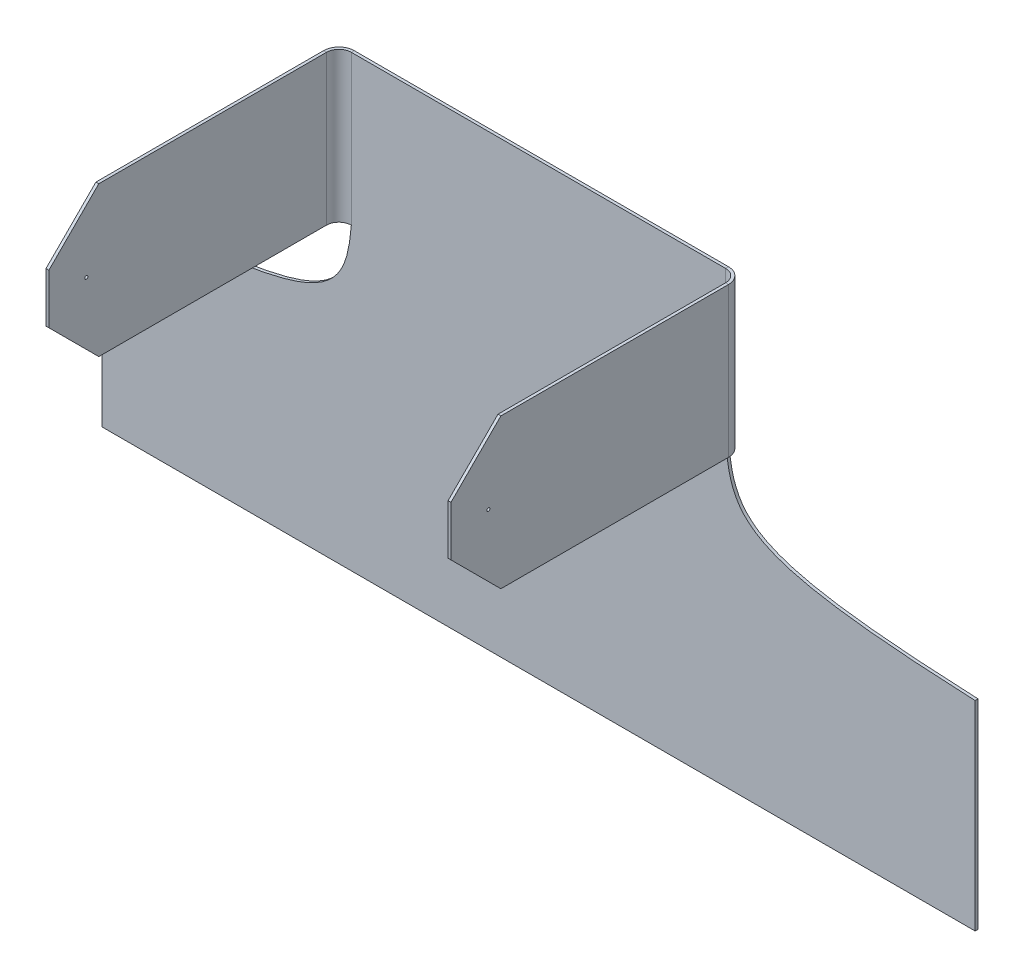
ISO-10303-21;
HEADER;
FILE_DESCRIPTION(('STEP AP214'),'2;1');
FILE_NAME('part.step','',(''),(''),'','','');
FILE_SCHEMA(('AUTOMOTIVE_DESIGN { 1 0 10303 214 1 1 1 1 }'));
ENDSEC;
DATA;
#1=APPLICATION_CONTEXT('core data for automotive mechanical design processes');
#2=APPLICATION_PROTOCOL_DEFINITION('international standard','automotive_design',2000,#1);
#3=PRODUCT_CONTEXT('',#1,'mechanical');
#4=PRODUCT('Part','Part','',(#3));
#5=PRODUCT_RELATED_PRODUCT_CATEGORY('part','',(#4));
#6=PRODUCT_DEFINITION_FORMATION('','',#4);
#7=PRODUCT_DEFINITION_CONTEXT('part definition',#1,'design');
#8=PRODUCT_DEFINITION('design','',#6,#7);
#9=PRODUCT_DEFINITION_SHAPE('','',#8);
#10=(LENGTH_UNIT() NAMED_UNIT(*) SI_UNIT(.MILLI.,.METRE.));
#11=(NAMED_UNIT(*) PLANE_ANGLE_UNIT() SI_UNIT($,.RADIAN.));
#12=(NAMED_UNIT(*) SI_UNIT($,.STERADIAN.) SOLID_ANGLE_UNIT());
#13=UNCERTAINTY_MEASURE_WITH_UNIT(LENGTH_MEASURE(1.E-05),#10,'distance_accuracy_value','');
#14=(GEOMETRIC_REPRESENTATION_CONTEXT(3) GLOBAL_UNCERTAINTY_ASSIGNED_CONTEXT((#13)) GLOBAL_UNIT_ASSIGNED_CONTEXT((#10,
#11,#12)) REPRESENTATION_CONTEXT('',''));
#15=CARTESIAN_POINT('',(0.,0.,0.));
#16=DIRECTION('',(0.,0.,1.));
#17=DIRECTION('',(1.,0.,0.));
#18=AXIS2_PLACEMENT_3D('',#15,#16,#17);
#19=CARTESIAN_POINT('',(13.8118325034129,38.0029528830563,0.));
#20=DIRECTION('',(0.,0.,-1.));
#21=DIRECTION('',(-1.,0.,0.));
#22=AXIS2_PLACEMENT_3D('',#19,#20,#21);
#23=PLANE('',#22);
#24=CARTESIAN_POINT('',(66.6047637195123,30.6321524390244,0.));
#25=CARTESIAN_POINT('',(8.97761047639618,33.1825692355034,0.));
#26=CARTESIAN_POINT('',(4.61743371969675,39.2705368266304,0.));
#27=CARTESIAN_POINT('',(3.10476371951222,56.0321524390244,0.));
#28=B_SPLINE_CURVE_WITH_KNOTS('',3,(#24,#25,#26,#27),.UNSPECIFIED.,.F.,.F.,(4,4),(0.,1.),.UNSPECIFIED.);
#29=CARTESIAN_POINT('',(66.6047637195122,30.6321524390244,0.));
#30=VERTEX_POINT('',#29);
#31=CARTESIAN_POINT('',(3.10476371951222,56.0321524390244,0.));
#32=VERTEX_POINT('',#31);
#33=EDGE_CURVE('E357',#30,#32,#28,.T.);
#34=ORIENTED_EDGE('',*,*,#33,.T.);
#35=DIRECTION('',(0.,1.,0.));
#36=VECTOR('',#35,1.);
#37=CARTESIAN_POINT('',(3.10476371951222,38.0029528830563,0.));
#38=LINE('',#37,#36);
#39=CARTESIAN_POINT('',(3.10476371951216,94.1321524390244,0.));
#40=VERTEX_POINT('',#39);
#41=EDGE_CURVE('E360',#32,#40,#38,.T.);
#42=ORIENTED_EDGE('',*,*,#41,.T.);
#43=DIRECTION('',(-1.,0.,0.));
#44=VECTOR('',#43,1.);
#45=CARTESIAN_POINT('',(-168.345236280488,94.1321524390244,0.));
#46=LINE('',#45,#44);
#47=CARTESIAN_POINT('',(-92.1452362804878,94.1321524390244,0.));
#48=VERTEX_POINT('',#47);
#49=EDGE_CURVE('E355',#40,#48,#46,.T.);
#50=ORIENTED_EDGE('',*,*,#49,.T.);
#51=DIRECTION('',(0.,1.,0.));
#52=VECTOR('',#51,1.);
#53=CARTESIAN_POINT('',(-92.1452362804878,38.0029528830563,0.));
#54=LINE('',#53,#52);
#55=CARTESIAN_POINT('',(-92.1452362804878,56.0321524390244,0.));
#56=VERTEX_POINT('',#55);
#57=EDGE_CURVE('E401',#56,#48,#54,.T.);
#58=ORIENTED_EDGE('',*,*,#57,.F.);
#59=CARTESIAN_POINT('',(-92.1452362804878,56.0321524390244,0.));
#60=CARTESIAN_POINT('',(-93.6579062806723,39.2705368266304,0.));
#61=CARTESIAN_POINT('',(-98.0180830373717,33.1825692355034,0.));
#62=CARTESIAN_POINT('',(-155.645236280488,30.6321524390244,0.));
#63=B_SPLINE_CURVE_WITH_KNOTS('',3,(#59,#60,#61,#62),.UNSPECIFIED.,.F.,.F.,(4,4),(0.,1.),.UNSPECIFIED.);
#64=CARTESIAN_POINT('',(-155.645236280488,30.6321524390244,0.));
#65=VERTEX_POINT('',#64);
#66=EDGE_CURVE('E422',#56,#65,#63,.T.);
#67=ORIENTED_EDGE('',*,*,#66,.T.);
#68=DIRECTION('',(0.,-1.,0.));
#69=VECTOR('',#68,1.);
#70=CARTESIAN_POINT('',(-155.645236280488,-20.1678475609756,0.));
#71=LINE('',#70,#69);
#72=CARTESIAN_POINT('',(-155.645236280488,-20.1678475609756,0.));
#73=VERTEX_POINT('',#72);
#74=EDGE_CURVE('E427',#65,#73,#71,.T.);
#75=ORIENTED_EDGE('',*,*,#74,.T.);
#76=DIRECTION('',(1.,0.,0.));
#77=VECTOR('',#76,1.);
#78=CARTESIAN_POINT('',(-155.645236280488,-20.1678475609756,0.));
#79=LINE('',#78,#77);
#80=CARTESIAN_POINT('',(66.6047637195122,-20.1678475609756,0.));
#81=VERTEX_POINT('',#80);
#82=EDGE_CURVE('E433',#73,#81,#79,.T.);
#83=ORIENTED_EDGE('',*,*,#82,.T.);
#84=DIRECTION('',(0.,1.,0.));
#85=VECTOR('',#84,1.);
#86=CARTESIAN_POINT('',(66.6047637195122,-20.1678475609756,0.));
#87=LINE('',#86,#85);
#88=EDGE_CURVE('E436',#81,#30,#87,.T.);
#89=ORIENTED_EDGE('',*,*,#88,.T.);
#90=EDGE_LOOP('',(#34,#42,#50,#58,#67,#75,#83,#89));
#91=FACE_BOUND('',#90,.T.);
#92=ADVANCED_FACE('F43',(#91),#23,.F.);
#93=CARTESIAN_POINT('',(-95.3202362804882,38.0029528830563,-108.347871408633));
#94=DIRECTION('',(-1.,0.,0.));
#95=DIRECTION('',(0.,0.,1.));
#96=AXIS2_PLACEMENT_3D('',#93,#94,#95);
#97=PLANE('',#96);
#98=CARTESIAN_POINT('',(-95.3202362804876,75.0821524390244,64.2841973752676));
#99=DIRECTION('',(1.,0.,0.));
#100=DIRECTION('',(0.,0.,1.));
#101=AXIS2_PLACEMENT_3D('',#98,#99,#100);
#102=CIRCLE('',#101,0.396874999999983);
#103=CARTESIAN_POINT('',(-95.3202362804876,75.0821524390244,64.6810723752676));
#104=VERTEX_POINT('',#103);
#105=EDGE_CURVE('E394',#104,#104,#102,.T.);
#106=ORIENTED_EDGE('',*,*,#105,.F.);
#107=EDGE_LOOP('',(#106));
#108=FACE_BOUND('',#107,.T.);
#109=DIRECTION('',(0.,-1.,0.));
#110=VECTOR('',#109,1.);
#111=CARTESIAN_POINT('',(-95.3202362804875,94.1321524390244,73.8091973752676));
#112=LINE('',#111,#110);
#113=CARTESIAN_POINT('',(-95.3202362804875,81.4321524390243,73.8091973752676));
#114=VERTEX_POINT('',#113);
#115=CARTESIAN_POINT('',(-95.3202362804875,68.7321524390243,73.8091973752676));
#116=VERTEX_POINT('',#115);
#117=EDGE_CURVE('E373',#114,#116,#112,.T.);
#118=ORIENTED_EDGE('',*,*,#117,.T.);
#119=DIRECTION('',(0.,0.707106781186546,0.707106781186549));
#120=VECTOR('',#119,1.);
#121=CARTESIAN_POINT('',(-95.3202362804875,68.7321524390243,73.8091973752676));
#122=LINE('',#121,#120);
#123=CARTESIAN_POINT('',(-95.3202362804876,56.0321524390244,61.1091973752676));
#124=VERTEX_POINT('',#123);
#125=EDGE_CURVE('E65',#116,#124,#122,.F.);
#126=ORIENTED_EDGE('',*,*,#125,.T.);
#127=DIRECTION('',(0.,0.,-1.));
#128=VECTOR('',#127,1.);
#129=CARTESIAN_POINT('',(-95.3202362804878,56.0321524390244,-2.3908026247324));
#130=LINE('',#129,#128);
#131=CARTESIAN_POINT('',(-95.3202362804878,56.0321524390244,3.17499999999997));
#132=VERTEX_POINT('',#131);
#133=EDGE_CURVE('E371',#124,#132,#130,.T.);
#134=ORIENTED_EDGE('',*,*,#133,.T.);
#135=DIRECTION('',(0.,1.,0.));
#136=VECTOR('',#135,1.);
#137=CARTESIAN_POINT('',(-95.3202362804878,38.0029528830563,3.17499999999997));
#138=LINE('',#137,#136);
#139=CARTESIAN_POINT('',(-95.3202362804878,94.1321524390244,3.175));
#140=VERTEX_POINT('',#139);
#141=EDGE_CURVE('E383',#132,#140,#138,.T.);
#142=ORIENTED_EDGE('',*,*,#141,.T.);
#143=DIRECTION('',(0.,0.,1.));
#144=VECTOR('',#143,1.);
#145=CARTESIAN_POINT('',(-95.3202362804875,94.1321524390244,73.8091973752676));
#146=LINE('',#145,#144);
#147=CARTESIAN_POINT('',(-95.3202362804876,94.1321524390244,61.1091973752676));
#148=VERTEX_POINT('',#147);
#149=EDGE_CURVE('E374',#140,#148,#146,.T.);
#150=ORIENTED_EDGE('',*,*,#149,.T.);
#151=DIRECTION('',(0.,0.707106781186549,-0.707106781186546));
#152=VECTOR('',#151,1.);
#153=CARTESIAN_POINT('',(-95.3202362804876,94.1321524390244,61.1091973752676));
#154=LINE('',#153,#152);
#155=EDGE_CURVE('E346',#148,#114,#154,.F.);
#156=ORIENTED_EDGE('',*,*,#155,.T.);
#157=EDGE_LOOP('',(#118,#126,#134,#142,#150,#156));
#158=FACE_BOUND('',#157,.T.);
#159=ADVANCED_FACE('F287',(#108,#158),#97,.F.);
#160=CARTESIAN_POINT('',(-96.0568362804878,56.0321524390244,-2.3908026247324));
#161=DIRECTION('',(0.,-1.,0.));
#162=DIRECTION('',(-1.,0.,0.));
#163=AXIS2_PLACEMENT_3D('',#160,#161,#162);
#164=PLANE('',#163);
#165=ORIENTED_EDGE('',*,*,#133,.F.);
#166=DIRECTION('',(-1.,0.,0.));
#167=VECTOR('',#166,1.);
#168=CARTESIAN_POINT('',(-96.0568362804876,56.0321524390244,61.1091973752676));
#169=LINE('',#168,#167);
#170=CARTESIAN_POINT('',(-96.0568362804876,56.0321524390244,61.1091973752676));
#171=VERTEX_POINT('',#170);
#172=EDGE_CURVE('E51',#124,#171,#169,.T.);
#173=ORIENTED_EDGE('',*,*,#172,.T.);
#174=DIRECTION('',(0.,0.,-1.));
#175=VECTOR('',#174,1.);
#176=CARTESIAN_POINT('',(-96.0568362804878,56.0321524390244,-2.3908026247324));
#177=LINE('',#176,#175);
#178=CARTESIAN_POINT('',(-96.0568362804878,56.0321524390244,3.17499999999997));
#179=VERTEX_POINT('',#178);
#180=EDGE_CURVE('E378',#171,#179,#177,.T.);
#181=ORIENTED_EDGE('',*,*,#180,.T.);
#182=DIRECTION('',(-1.,0.,0.));
#183=VECTOR('',#182,1.);
#184=CARTESIAN_POINT('',(-96.0568362804878,56.0321524390244,3.17499999999997));
#185=LINE('',#184,#183);
#186=EDGE_CURVE('E366',#132,#179,#185,.T.);
#187=ORIENTED_EDGE('',*,*,#186,.F.);
#188=EDGE_LOOP('',(#165,#173,#181,#187));
#189=FACE_BOUND('',#188,.T.);
#190=ADVANCED_FACE('F279',(#189),#164,.T.);
#191=CARTESIAN_POINT('',(-96.0568362804876,94.1321524390244,73.8091973752676));
#192=DIRECTION('',(0.,0.,1.));
#193=DIRECTION('',(1.,0.,0.));
#194=AXIS2_PLACEMENT_3D('',#191,#192,#193);
#195=PLANE('',#194);
#196=DIRECTION('',(0.,-1.,0.));
#197=VECTOR('',#196,1.);
#198=CARTESIAN_POINT('',(-96.0568362804876,94.1321524390244,73.8091973752676));
#199=LINE('',#198,#197);
#200=CARTESIAN_POINT('',(-96.0568362804876,81.4321524390245,73.8091973752676));
#201=VERTEX_POINT('',#200);
#202=CARTESIAN_POINT('',(-96.0568362804876,68.7321524390243,73.8091973752676));
#203=VERTEX_POINT('',#202);
#204=EDGE_CURVE('E370',#201,#203,#199,.T.);
#205=ORIENTED_EDGE('',*,*,#204,.T.);
#206=DIRECTION('',(1.,0.,0.));
#207=VECTOR('',#206,1.);
#208=CARTESIAN_POINT('',(-96.0568362804876,68.7321524390243,73.8091973752676));
#209=LINE('',#208,#207);
#210=EDGE_CURVE('E324',#203,#116,#209,.T.);
#211=ORIENTED_EDGE('',*,*,#210,.T.);
#212=ORIENTED_EDGE('',*,*,#117,.F.);
#213=DIRECTION('',(-1.,0.,0.));
#214=VECTOR('',#213,1.);
#215=CARTESIAN_POINT('',(-96.0568362804876,81.4321524390243,73.8091973752676));
#216=LINE('',#215,#214);
#217=EDGE_CURVE('E344',#114,#201,#216,.T.);
#218=ORIENTED_EDGE('',*,*,#217,.T.);
#219=EDGE_LOOP('',(#205,#211,#212,#218));
#220=FACE_BOUND('',#219,.T.);
#221=ADVANCED_FACE('F275',(#220),#195,.T.);
#222=CARTESIAN_POINT('',(-96.0568362804876,94.1321524390244,73.8091973752676));
#223=DIRECTION('',(0.,1.,0.));
#224=DIRECTION('',(0.,0.,1.));
#225=AXIS2_PLACEMENT_3D('',#222,#223,#224);
#226=PLANE('',#225);
#227=DIRECTION('',(0.,0.,1.));
#228=VECTOR('',#227,1.);
#229=CARTESIAN_POINT('',(-96.0568362804876,94.1321524390244,73.8091973752676));
#230=LINE('',#229,#228);
#231=CARTESIAN_POINT('',(-96.0568362804877,94.1321524390244,3.17500000000003));
#232=VERTEX_POINT('',#231);
#233=CARTESIAN_POINT('',(-96.0568362804876,94.1321524390244,61.1091973752677));
#234=VERTEX_POINT('',#233);
#235=EDGE_CURVE('E367',#232,#234,#230,.T.);
#236=ORIENTED_EDGE('',*,*,#235,.T.);
#237=DIRECTION('',(1.,0.,0.));
#238=VECTOR('',#237,1.);
#239=CARTESIAN_POINT('',(-96.0568362804876,94.1321524390244,61.1091973752676));
#240=LINE('',#239,#238);
#241=EDGE_CURVE('E348',#234,#148,#240,.T.);
#242=ORIENTED_EDGE('',*,*,#241,.T.);
#243=ORIENTED_EDGE('',*,*,#149,.F.);
#244=DIRECTION('',(1.,0.,0.));
#245=VECTOR('',#244,1.);
#246=CARTESIAN_POINT('',(-96.0568362804878,94.1321524390244,3.17499999999997));
#247=LINE('',#246,#245);
#248=EDGE_CURVE('E386',#232,#140,#247,.T.);
#249=ORIENTED_EDGE('',*,*,#248,.F.);
#250=EDGE_LOOP('',(#236,#242,#243,#249));
#251=FACE_BOUND('',#250,.T.);
#252=ADVANCED_FACE('F278',(#251),#226,.T.);
#253=CARTESIAN_POINT('',(-96.0568362804882,38.0029528830563,-108.347871408633));
#254=DIRECTION('',(-1.,0.,0.));
#255=DIRECTION('',(0.,0.,1.));
#256=AXIS2_PLACEMENT_3D('',#253,#254,#255);
#257=PLANE('',#256);
#258=ORIENTED_EDGE('',*,*,#180,.F.);
#259=DIRECTION('',(0.,-0.707106781186546,-0.707106781186549));
#260=VECTOR('',#259,1.);
#261=CARTESIAN_POINT('',(-96.056836280488,-37.71098173091,-32.6339367946672));
#262=LINE('',#261,#260);
#263=EDGE_CURVE('E12',#171,#203,#262,.F.);
#264=ORIENTED_EDGE('',*,*,#263,.T.);
#265=ORIENTED_EDGE('',*,*,#204,.F.);
#266=DIRECTION('',(0.,-0.707106781186549,0.707106781186546));
#267=VECTOR('',#266,1.);
#268=CARTESIAN_POINT('',(-96.0568362804878,150.796087052991,4.44526276130167));
#269=LINE('',#268,#267);
#270=EDGE_CURVE('E342',#201,#234,#269,.F.);
#271=ORIENTED_EDGE('',*,*,#270,.T.);
#272=ORIENTED_EDGE('',*,*,#235,.F.);
#273=DIRECTION('',(0.,1.,0.));
#274=VECTOR('',#273,1.);
#275=CARTESIAN_POINT('',(-96.0568362804878,38.0029528830563,3.17499999999997));
#276=LINE('',#275,#274);
#277=EDGE_CURVE('E380',#179,#232,#276,.T.);
#278=ORIENTED_EDGE('',*,*,#277,.F.);
#279=EDGE_LOOP('',(#258,#264,#265,#271,#272,#278));
#280=FACE_BOUND('',#279,.T.);
#281=CARTESIAN_POINT('',(-96.0568362804876,75.0821524390244,64.2841973752676));
#282=DIRECTION('',(1.,0.,0.));
#283=DIRECTION('',(0.,0.,1.));
#284=AXIS2_PLACEMENT_3D('',#281,#282,#283);
#285=CIRCLE('',#284,0.396874999999983);
#286=CARTESIAN_POINT('',(-96.0568362804876,75.0821524390244,64.6810723752676));
#287=VERTEX_POINT('',#286);
#288=EDGE_CURVE('E377',#287,#287,#285,.T.);
#289=ORIENTED_EDGE('',*,*,#288,.T.);
#290=EDGE_LOOP('',(#289));
#291=FACE_BOUND('',#290,.T.);
#292=ADVANCED_FACE('F273',(#280,#291),#257,.T.);
#293=CARTESIAN_POINT('',(-96.0568362804876,75.0821524390244,64.2841973752676));
#294=DIRECTION('',(1.,0.,0.));
#295=DIRECTION('',(0.,0.,-1.));
#296=AXIS2_PLACEMENT_3D('',#293,#294,#295);
#297=CYLINDRICAL_SURFACE('',#296,0.396874999999983);
#298=ORIENTED_EDGE('',*,*,#288,.F.);
#299=EDGE_LOOP('',(#298));
#300=FACE_BOUND('',#299,.T.);
#301=ORIENTED_EDGE('',*,*,#105,.T.);
#302=EDGE_LOOP('',(#301));
#303=FACE_BOUND('',#302,.T.);
#304=ADVANCED_FACE('F269',(#300,#303),#297,.F.);
#305=CARTESIAN_POINT('',(-155.645236280488,-20.1678475609756,-0.7366));
#306=DIRECTION('',(-1.,0.,0.));
#307=DIRECTION('',(0.,0.,1.));
#308=AXIS2_PLACEMENT_3D('',#305,#306,#307);
#309=PLANE('',#308);
#310=ORIENTED_EDGE('',*,*,#74,.F.);
#311=DIRECTION('',(0.,0.,1.));
#312=VECTOR('',#311,1.);
#313=CARTESIAN_POINT('',(-155.645236280488,30.6321524390244,-0.7366));
#314=LINE('',#313,#312);
#315=CARTESIAN_POINT('',(-155.645236280488,30.6321524390244,-0.7366));
#316=VERTEX_POINT('',#315);
#317=EDGE_CURVE('E397',#316,#65,#314,.T.);
#318=ORIENTED_EDGE('',*,*,#317,.F.);
#319=DIRECTION('',(0.,-1.,0.));
#320=VECTOR('',#319,1.);
#321=CARTESIAN_POINT('',(-155.645236280488,-20.1678475609756,-0.7366));
#322=LINE('',#321,#320);
#323=CARTESIAN_POINT('',(-155.645236280488,-20.1678475609756,-0.7366));
#324=VERTEX_POINT('',#323);
#325=EDGE_CURVE('E404',#316,#324,#322,.T.);
#326=ORIENTED_EDGE('',*,*,#325,.T.);
#327=DIRECTION('',(0.,0.,1.));
#328=VECTOR('',#327,1.);
#329=CARTESIAN_POINT('',(-155.645236280488,-20.1678475609756,-0.7366));
#330=LINE('',#329,#328);
#331=EDGE_CURVE('E407',#324,#73,#330,.T.);
#332=ORIENTED_EDGE('',*,*,#331,.T.);
#333=EDGE_LOOP('',(#310,#318,#326,#332));
#334=FACE_BOUND('',#333,.T.);
#335=ADVANCED_FACE('F272',(#334),#309,.T.);
#336=CARTESIAN_POINT('',(-155.645236280488,-20.1678475609756,-0.7366));
#337=DIRECTION('',(0.,-1.,0.));
#338=DIRECTION('',(0.,0.,-1.));
#339=AXIS2_PLACEMENT_3D('',#336,#337,#338);
#340=PLANE('',#339);
#341=ORIENTED_EDGE('',*,*,#82,.F.);
#342=ORIENTED_EDGE('',*,*,#331,.F.);
#343=DIRECTION('',(1.,0.,0.));
#344=VECTOR('',#343,1.);
#345=CARTESIAN_POINT('',(-155.645236280488,-20.1678475609756,-0.7366));
#346=LINE('',#345,#344);
#347=CARTESIAN_POINT('',(66.6047637195122,-20.1678475609756,-0.7366));
#348=VERTEX_POINT('',#347);
#349=EDGE_CURVE('E409',#324,#348,#346,.T.);
#350=ORIENTED_EDGE('',*,*,#349,.T.);
#351=DIRECTION('',(0.,0.,1.));
#352=VECTOR('',#351,1.);
#353=CARTESIAN_POINT('',(66.6047637195122,-20.1678475609756,-0.7366));
#354=LINE('',#353,#352);
#355=EDGE_CURVE('E412',#348,#81,#354,.T.);
#356=ORIENTED_EDGE('',*,*,#355,.T.);
#357=EDGE_LOOP('',(#341,#342,#350,#356));
#358=FACE_BOUND('',#357,.T.);
#359=ADVANCED_FACE('F473',(#358),#340,.T.);
#360=CARTESIAN_POINT('',(66.6047637195122,-20.1678475609756,-0.7366));
#361=DIRECTION('',(1.,0.,0.));
#362=DIRECTION('',(0.,0.,-1.));
#363=AXIS2_PLACEMENT_3D('',#360,#361,#362);
#364=PLANE('',#363);
#365=ORIENTED_EDGE('',*,*,#88,.F.);
#366=ORIENTED_EDGE('',*,*,#355,.F.);
#367=DIRECTION('',(0.,1.,0.));
#368=VECTOR('',#367,1.);
#369=CARTESIAN_POINT('',(66.6047637195122,-20.1678475609756,-0.7366));
#370=LINE('',#369,#368);
#371=CARTESIAN_POINT('',(66.6047637195122,30.6321524390244,-0.7366));
#372=VERTEX_POINT('',#371);
#373=EDGE_CURVE('E414',#348,#372,#370,.T.);
#374=ORIENTED_EDGE('',*,*,#373,.T.);
#375=DIRECTION('',(0.,0.,1.));
#376=VECTOR('',#375,1.);
#377=CARTESIAN_POINT('',(66.6047637195122,30.6321524390244,-0.7366));
#378=LINE('',#377,#376);
#379=EDGE_CURVE('E245',#372,#30,#378,.T.);
#380=ORIENTED_EDGE('',*,*,#379,.T.);
#381=EDGE_LOOP('',(#365,#366,#374,#380));
#382=FACE_BOUND('',#381,.T.);
#383=ADVANCED_FACE('F260',(#382),#364,.T.);
#384=CARTESIAN_POINT('',(66.6047637195123,30.6321524390244,-0.7366));
#385=CARTESIAN_POINT('',(8.97761047639618,33.1825692355034,-0.7366));
#386=CARTESIAN_POINT('',(4.61743371969675,39.2705368266304,-0.7366));
#387=CARTESIAN_POINT('',(3.10476371951222,56.0321524390244,-0.7366));
#388=B_SPLINE_CURVE_WITH_KNOTS('',3,(#384,#385,#386,#387),.UNSPECIFIED.,.F.,.F.,(4,4),(0.,1.),.UNSPECIFIED.);
#389=DIRECTION('',(0.,0.,1.));
#390=VECTOR('',#389,1.);
#391=SURFACE_OF_LINEAR_EXTRUSION('',#388,#390);
#392=ORIENTED_EDGE('',*,*,#33,.F.);
#393=ORIENTED_EDGE('',*,*,#379,.F.);
#394=CARTESIAN_POINT('',(3.10476371951222,56.0321524390244,-0.7366));
#395=VERTEX_POINT('',#394);
#396=EDGE_CURVE('E238',#372,#395,#388,.T.);
#397=ORIENTED_EDGE('',*,*,#396,.T.);
#398=DIRECTION('',(0.,0.,1.));
#399=VECTOR('',#398,1.);
#400=CARTESIAN_POINT('',(3.10476371951222,56.0321524390244,-0.7366));
#401=LINE('',#400,#399);
#402=EDGE_CURVE('E351',#395,#32,#401,.T.);
#403=ORIENTED_EDGE('',*,*,#402,.T.);
#404=EDGE_LOOP('',(#392,#393,#397,#403));
#405=FACE_BOUND('',#404,.T.);
#406=ADVANCED_FACE('F255',(#405),#391,.T.);
#407=CARTESIAN_POINT('',(13.8118325034129,38.0029528830563,-0.7366));
#408=DIRECTION('',(0.,0.,-1.));
#409=DIRECTION('',(-1.,0.,0.));
#410=AXIS2_PLACEMENT_3D('',#407,#408,#409);
#411=PLANE('',#410);
#412=DIRECTION('',(0.,1.,0.));
#413=VECTOR('',#412,1.);
#414=CARTESIAN_POINT('',(3.10476371951222,38.0029528830563,-0.7366));
#415=LINE('',#414,#413);
#416=CARTESIAN_POINT('',(3.10476371951215,94.1321524390244,-0.7366));
#417=VERTEX_POINT('',#416);
#418=EDGE_CURVE('E216',#395,#417,#415,.T.);
#419=ORIENTED_EDGE('',*,*,#418,.F.);
#420=ORIENTED_EDGE('',*,*,#396,.F.);
#421=ORIENTED_EDGE('',*,*,#373,.F.);
#422=ORIENTED_EDGE('',*,*,#349,.F.);
#423=ORIENTED_EDGE('',*,*,#325,.F.);
#424=CARTESIAN_POINT('',(-92.1452362804878,56.0321524390244,-0.7366));
#425=CARTESIAN_POINT('',(-93.6579062806723,39.2705368266304,-0.7366));
#426=CARTESIAN_POINT('',(-98.0180830373717,33.1825692355034,-0.7366));
#427=CARTESIAN_POINT('',(-155.645236280488,30.6321524390244,-0.7366));
#428=B_SPLINE_CURVE_WITH_KNOTS('',3,(#424,#425,#426,#427),.UNSPECIFIED.,.F.,.F.,(4,4),(0.,1.),.UNSPECIFIED.);
#429=CARTESIAN_POINT('',(-92.1452362804878,56.0321524390244,-0.736599999999994));
#430=VERTEX_POINT('',#429);
#431=EDGE_CURVE('E246',#430,#316,#428,.T.);
#432=ORIENTED_EDGE('',*,*,#431,.F.);
#433=DIRECTION('',(0.,1.,0.));
#434=VECTOR('',#433,1.);
#435=CARTESIAN_POINT('',(-92.1452362804878,38.0029528830563,-0.7366));
#436=LINE('',#435,#434);
#437=CARTESIAN_POINT('',(-92.1452362804878,94.1321524390244,-0.736599999999994));
#438=VERTEX_POINT('',#437);
#439=EDGE_CURVE('E244',#430,#438,#436,.T.);
#440=ORIENTED_EDGE('',*,*,#439,.T.);
#441=DIRECTION('',(-1.,0.,0.));
#442=VECTOR('',#441,1.);
#443=CARTESIAN_POINT('',(-168.345236280488,94.1321524390244,-0.7366));
#444=LINE('',#443,#442);
#445=EDGE_CURVE('E352',#417,#438,#444,.T.);
#446=ORIENTED_EDGE('',*,*,#445,.F.);
#447=EDGE_LOOP('',(#419,#420,#421,#422,#423,#432,#440,#446));
#448=FACE_BOUND('',#447,.T.);
#449=ADVANCED_FACE('F259',(#448),#411,.T.);
#450=CARTESIAN_POINT('',(-168.345236280488,94.1321524390244,-0.7366));
#451=DIRECTION('',(0.,1.,0.));
#452=DIRECTION('',(-1.,0.,0.));
#453=AXIS2_PLACEMENT_3D('',#450,#451,#452);
#454=PLANE('',#453);
#455=DIRECTION('',(0.,0.,1.));
#456=VECTOR('',#455,1.);
#457=CARTESIAN_POINT('',(3.10476371951221,94.1321524390244,-0.7366));
#458=LINE('',#457,#456);
#459=EDGE_CURVE('E363',#417,#40,#458,.T.);
#460=ORIENTED_EDGE('',*,*,#459,.F.);
#461=ORIENTED_EDGE('',*,*,#445,.T.);
#462=DIRECTION('',(0.,0.,1.));
#463=VECTOR('',#462,1.);
#464=CARTESIAN_POINT('',(-92.1452362804878,94.1321524390244,-0.7366));
#465=LINE('',#464,#463);
#466=EDGE_CURVE('E354',#438,#48,#465,.T.);
#467=ORIENTED_EDGE('',*,*,#466,.T.);
#468=ORIENTED_EDGE('',*,*,#49,.F.);
#469=EDGE_LOOP('',(#460,#461,#467,#468));
#470=FACE_BOUND('',#469,.T.);
#471=ADVANCED_FACE('F267',(#470),#454,.T.);
#472=DIRECTION('',(0.,0.,1.));
#473=VECTOR('',#472,1.);
#474=SURFACE_OF_LINEAR_EXTRUSION('',#428,#473);
#475=ORIENTED_EDGE('',*,*,#66,.F.);
#476=DIRECTION('',(0.,0.,1.));
#477=VECTOR('',#476,1.);
#478=CARTESIAN_POINT('',(-92.1452362804878,56.0321524390244,-0.7366));
#479=LINE('',#478,#477);
#480=EDGE_CURVE('E235',#430,#56,#479,.T.);
#481=ORIENTED_EDGE('',*,*,#480,.F.);
#482=ORIENTED_EDGE('',*,*,#431,.T.);
#483=ORIENTED_EDGE('',*,*,#317,.T.);
#484=EDGE_LOOP('',(#475,#481,#482,#483));
#485=FACE_BOUND('',#484,.T.);
#486=ADVANCED_FACE('F263',(#485),#474,.T.);
#487=CARTESIAN_POINT('',(-92.1452362804878,56.0321524390244,3.175));
#488=DIRECTION('',(0.,-1.,0.));
#489=DIRECTION('',(0.,0.,-1.));
#490=AXIS2_PLACEMENT_3D('',#487,#488,#489);
#491=PLANE('',#490);
#492=ORIENTED_EDGE('',*,*,#480,.T.);
#493=CARTESIAN_POINT('',(-92.1452362804878,56.0321524390244,3.175));
#494=DIRECTION('',(0.,1.,0.));
#495=DIRECTION('',(-1.,0.,0.));
#496=AXIS2_PLACEMENT_3D('',#493,#494,#495);
#497=CIRCLE('',#496,3.175);
#498=EDGE_CURVE('E217',#56,#132,#497,.T.);
#499=ORIENTED_EDGE('',*,*,#498,.T.);
#500=ORIENTED_EDGE('',*,*,#186,.T.);
#501=CARTESIAN_POINT('',(-92.1452362804878,56.0321524390244,3.175));
#502=DIRECTION('',(0.,1.,0.));
#503=DIRECTION('',(0.,0.,-1.));
#504=AXIS2_PLACEMENT_3D('',#501,#502,#503);
#505=CIRCLE('',#504,3.91159999999999);
#506=EDGE_CURVE('E229',#430,#179,#505,.T.);
#507=ORIENTED_EDGE('',*,*,#506,.F.);
#508=EDGE_LOOP('',(#492,#499,#500,#507));
#509=FACE_BOUND('',#508,.T.);
#510=ADVANCED_FACE('F266',(#509),#491,.T.);
#511=CARTESIAN_POINT('',(-92.1452362804878,94.1321524390244,3.175));
#512=DIRECTION('',(0.,1.,0.));
#513=DIRECTION('',(0.,0.,1.));
#514=AXIS2_PLACEMENT_3D('',#511,#512,#513);
#515=PLANE('',#514);
#516=ORIENTED_EDGE('',*,*,#248,.T.);
#517=CARTESIAN_POINT('',(-92.1452362804878,94.1321524390244,3.175));
#518=DIRECTION('',(0.,1.,0.));
#519=DIRECTION('',(-1.,0.,0.));
#520=AXIS2_PLACEMENT_3D('',#517,#518,#519);
#521=CIRCLE('',#520,3.175);
#522=EDGE_CURVE('E221',#140,#48,#521,.F.);
#523=ORIENTED_EDGE('',*,*,#522,.T.);
#524=ORIENTED_EDGE('',*,*,#466,.F.);
#525=CARTESIAN_POINT('',(-92.1452362804878,94.1321524390244,3.175));
#526=DIRECTION('',(0.,-1.,0.));
#527=DIRECTION('',(0.,0.,1.));
#528=AXIS2_PLACEMENT_3D('',#525,#526,#527);
#529=CIRCLE('',#528,3.91159999999999);
#530=EDGE_CURVE('E232',#232,#438,#529,.T.);
#531=ORIENTED_EDGE('',*,*,#530,.F.);
#532=EDGE_LOOP('',(#516,#523,#524,#531));
#533=FACE_BOUND('',#532,.T.);
#534=ADVANCED_FACE('F465',(#533),#515,.T.);
#535=CARTESIAN_POINT('',(-92.1452362804878,36.5707159763646,3.175));
#536=DIRECTION('',(0.,1.,0.));
#537=DIRECTION('',(-1.,0.,0.));
#538=AXIS2_PLACEMENT_3D('',#535,#536,#537);
#539=CYLINDRICAL_SURFACE('',#538,3.9116);
#540=ORIENTED_EDGE('',*,*,#530,.T.);
#541=ORIENTED_EDGE('',*,*,#439,.F.);
#542=ORIENTED_EDGE('',*,*,#506,.T.);
#543=ORIENTED_EDGE('',*,*,#277,.T.);
#544=EDGE_LOOP('',(#540,#541,#542,#543));
#545=FACE_BOUND('',#544,.T.);
#546=ADVANCED_FACE('F508',(#545),#539,.T.);
#547=CARTESIAN_POINT('',(-92.1452362804878,36.5707159763646,3.175));
#548=DIRECTION('',(0.,1.,0.));
#549=DIRECTION('',(-1.,0.,0.));
#550=AXIS2_PLACEMENT_3D('',#547,#548,#549);
#551=CYLINDRICAL_SURFACE('',#550,3.175);
#552=ORIENTED_EDGE('',*,*,#522,.F.);
#553=ORIENTED_EDGE('',*,*,#141,.F.);
#554=ORIENTED_EDGE('',*,*,#498,.F.);
#555=ORIENTED_EDGE('',*,*,#57,.T.);
#556=EDGE_LOOP('',(#552,#553,#554,#555));
#557=FACE_BOUND('',#556,.T.);
#558=ADVANCED_FACE('F461',(#557),#551,.F.);
#559=CARTESIAN_POINT('',(3.10476371951222,56.0321524390244,3.175));
#560=DIRECTION('',(0.,-1.,0.));
#561=DIRECTION('',(0.,0.,-1.));
#562=AXIS2_PLACEMENT_3D('',#559,#560,#561);
#563=PLANE('',#562);
#564=DIRECTION('',(1.,0.,0.));
#565=VECTOR('',#564,1.);
#566=CARTESIAN_POINT('',(7.01636371951222,56.0321524390244,3.17500000000001));
#567=LINE('',#566,#565);
#568=CARTESIAN_POINT('',(6.27976371951222,56.0321524390244,3.17500000000001));
#569=VERTEX_POINT('',#568);
#570=CARTESIAN_POINT('',(7.01636371951222,56.0321524390244,3.17500000000001));
#571=VERTEX_POINT('',#570);
#572=EDGE_CURVE('E496',#569,#571,#567,.T.);
#573=ORIENTED_EDGE('',*,*,#572,.F.);
#574=CARTESIAN_POINT('',(3.10476371951222,56.0321524390244,3.175));
#575=DIRECTION('',(0.,-1.,0.));
#576=DIRECTION('',(1.,0.,0.));
#577=AXIS2_PLACEMENT_3D('',#574,#575,#576);
#578=CIRCLE('',#577,3.175);
#579=EDGE_CURVE('E226',#569,#32,#578,.F.);
#580=ORIENTED_EDGE('',*,*,#579,.T.);
#581=ORIENTED_EDGE('',*,*,#402,.F.);
#582=CARTESIAN_POINT('',(3.10476371951222,56.0321524390244,3.175));
#583=DIRECTION('',(0.,1.,0.));
#584=DIRECTION('',(0.,0.,-1.));
#585=AXIS2_PLACEMENT_3D('',#582,#583,#584);
#586=CIRCLE('',#585,3.9116);
#587=EDGE_CURVE('E218',#571,#395,#586,.T.);
#588=ORIENTED_EDGE('',*,*,#587,.F.);
#589=EDGE_LOOP('',(#573,#580,#581,#588));
#590=FACE_BOUND('',#589,.T.);
#591=ADVANCED_FACE('F500',(#590),#563,.T.);
#592=CARTESIAN_POINT('',(3.10476371951221,94.1321524390244,3.175));
#593=DIRECTION('',(0.,1.,0.));
#594=DIRECTION('',(0.,0.,1.));
#595=AXIS2_PLACEMENT_3D('',#592,#593,#594);
#596=PLANE('',#595);
#597=CARTESIAN_POINT('',(3.10476371951221,94.1321524390244,3.175));
#598=DIRECTION('',(0.,-1.,0.));
#599=DIRECTION('',(1.,0.,0.));
#600=AXIS2_PLACEMENT_3D('',#597,#598,#599);
#601=CIRCLE('',#600,3.175);
#602=CARTESIAN_POINT('',(6.27976371951221,94.1321524390244,3.17499999999997));
#603=VERTEX_POINT('',#602);
#604=EDGE_CURVE('E211',#40,#603,#601,.T.);
#605=ORIENTED_EDGE('',*,*,#604,.T.);
#606=DIRECTION('',(-1.,0.,0.));
#607=VECTOR('',#606,1.);
#608=CARTESIAN_POINT('',(7.01636371951221,94.1321524390244,3.17500000000003));
#609=LINE('',#608,#607);
#610=CARTESIAN_POINT('',(7.01636371951221,94.1321524390244,3.17499999999997));
#611=VERTEX_POINT('',#610);
#612=EDGE_CURVE('E183',#611,#603,#609,.T.);
#613=ORIENTED_EDGE('',*,*,#612,.F.);
#614=CARTESIAN_POINT('',(3.10476371951221,94.1321524390244,3.175));
#615=DIRECTION('',(0.,-1.,0.));
#616=DIRECTION('',(0.,0.,1.));
#617=AXIS2_PLACEMENT_3D('',#614,#615,#616);
#618=CIRCLE('',#617,3.9116);
#619=EDGE_CURVE('E208',#417,#611,#618,.T.);
#620=ORIENTED_EDGE('',*,*,#619,.F.);
#621=ORIENTED_EDGE('',*,*,#459,.T.);
#622=EDGE_LOOP('',(#605,#613,#620,#621));
#623=FACE_BOUND('',#622,.T.);
#624=ADVANCED_FACE('F207',(#623),#596,.T.);
#625=CARTESIAN_POINT('',(3.10476371951221,113.593588901684,3.175));
#626=DIRECTION('',(0.,-1.,0.));
#627=DIRECTION('',(1.,0.,0.));
#628=AXIS2_PLACEMENT_3D('',#625,#626,#627);
#629=CYLINDRICAL_SURFACE('',#628,3.9116);
#630=ORIENTED_EDGE('',*,*,#418,.T.);
#631=ORIENTED_EDGE('',*,*,#619,.T.);
#632=DIRECTION('',(0.,1.,0.));
#633=VECTOR('',#632,1.);
#634=CARTESIAN_POINT('',(7.01636371951222,38.0029528830563,3.17500000000001));
#635=LINE('',#634,#633);
#636=EDGE_CURVE('E190',#571,#611,#635,.T.);
#637=ORIENTED_EDGE('',*,*,#636,.F.);
#638=ORIENTED_EDGE('',*,*,#587,.T.);
#639=EDGE_LOOP('',(#630,#631,#637,#638));
#640=FACE_BOUND('',#639,.T.);
#641=ADVANCED_FACE('F214',(#640),#629,.T.);
#642=CARTESIAN_POINT('',(3.10476371951221,113.593588901684,3.175));
#643=DIRECTION('',(0.,-1.,0.));
#644=DIRECTION('',(1.,0.,0.));
#645=AXIS2_PLACEMENT_3D('',#642,#643,#644);
#646=CYLINDRICAL_SURFACE('',#645,3.175);
#647=ORIENTED_EDGE('',*,*,#41,.F.);
#648=ORIENTED_EDGE('',*,*,#579,.F.);
#649=DIRECTION('',(0.,1.,0.));
#650=VECTOR('',#649,1.);
#651=CARTESIAN_POINT('',(6.27976371951222,38.0029528830563,3.17500000000001));
#652=LINE('',#651,#650);
#653=EDGE_CURVE('E479',#569,#603,#652,.T.);
#654=ORIENTED_EDGE('',*,*,#653,.T.);
#655=ORIENTED_EDGE('',*,*,#604,.F.);
#656=EDGE_LOOP('',(#647,#648,#654,#655));
#657=FACE_BOUND('',#656,.T.);
#658=ADVANCED_FACE('F477',(#657),#646,.F.);
#659=CARTESIAN_POINT('',(7.01636371951197,94.1321524390244,73.8091973752677));
#660=DIRECTION('',(0.,0.,1.));
#661=DIRECTION('',(1.,0.,0.));
#662=AXIS2_PLACEMENT_3D('',#659,#660,#661);
#663=PLANE('',#662);
#664=DIRECTION('',(0.,1.,0.));
#665=VECTOR('',#664,1.);
#666=CARTESIAN_POINT('',(6.27976371951197,94.1321524390244,73.8091973752677));
#667=LINE('',#666,#665);
#668=CARTESIAN_POINT('',(6.27976371951197,68.7321524390243,73.8091973752677));
#669=VERTEX_POINT('',#668);
#670=CARTESIAN_POINT('',(6.27976371951197,81.4321524390244,73.8091973752677));
#671=VERTEX_POINT('',#670);
#672=EDGE_CURVE('E492',#669,#671,#667,.T.);
#673=ORIENTED_EDGE('',*,*,#672,.F.);
#674=DIRECTION('',(1.,0.,0.));
#675=VECTOR('',#674,1.);
#676=CARTESIAN_POINT('',(7.01636371951197,68.7321524390243,73.8091973752677));
#677=LINE('',#676,#675);
#678=CARTESIAN_POINT('',(7.01636371951197,68.7321524390244,73.8091973752677));
#679=VERTEX_POINT('',#678);
#680=EDGE_CURVE('E321',#669,#679,#677,.T.);
#681=ORIENTED_EDGE('',*,*,#680,.T.);
#682=DIRECTION('',(0.,1.,0.));
#683=VECTOR('',#682,1.);
#684=CARTESIAN_POINT('',(7.01636371951197,94.1321524390244,73.8091973752677));
#685=LINE('',#684,#683);
#686=CARTESIAN_POINT('',(7.01636371951197,81.4321524390244,73.8091973752677));
#687=VERTEX_POINT('',#686);
#688=EDGE_CURVE('E483',#679,#687,#685,.T.);
#689=ORIENTED_EDGE('',*,*,#688,.T.);
#690=DIRECTION('',(-1.,0.,0.));
#691=VECTOR('',#690,1.);
#692=CARTESIAN_POINT('',(7.01636371951197,81.4321524390244,73.8091973752677));
#693=LINE('',#692,#691);
#694=EDGE_CURVE('E339',#687,#671,#693,.T.);
#695=ORIENTED_EDGE('',*,*,#694,.T.);
#696=EDGE_LOOP('',(#673,#681,#689,#695));
#697=FACE_BOUND('',#696,.T.);
#698=ADVANCED_FACE('F671',(#697),#663,.T.);
#699=CARTESIAN_POINT('',(7.016363719512,75.0821524390244,64.2841973752676));
#700=DIRECTION('',(-1.,0.,0.));
#701=DIRECTION('',(0.,0.,1.));
#702=AXIS2_PLACEMENT_3D('',#699,#700,#701);
#703=CYLINDRICAL_SURFACE('',#702,0.396874999999996);
#704=CARTESIAN_POINT('',(7.016363719512,75.0821524390244,64.2841973752676));
#705=DIRECTION('',(-1.,0.,0.));
#706=DIRECTION('',(0.,0.,1.));
#707=AXIS2_PLACEMENT_3D('',#704,#705,#706);
#708=CIRCLE('',#707,0.396874999999996);
#709=CARTESIAN_POINT('',(7.016363719512,75.0821524390244,64.6810723752676));
#710=VERTEX_POINT('',#709);
#711=EDGE_CURVE('E202',#710,#710,#708,.T.);
#712=ORIENTED_EDGE('',*,*,#711,.F.);
#713=EDGE_LOOP('',(#712));
#714=FACE_BOUND('',#713,.T.);
#715=CARTESIAN_POINT('',(6.279763719512,75.0821524390244,64.2841973752676));
#716=DIRECTION('',(-1.,0.,0.));
#717=DIRECTION('',(0.,0.,1.));
#718=AXIS2_PLACEMENT_3D('',#715,#716,#717);
#719=CIRCLE('',#718,0.396874999999996);
#720=CARTESIAN_POINT('',(6.279763719512,75.0821524390244,64.6810723752676));
#721=VERTEX_POINT('',#720);
#722=EDGE_CURVE('E484',#721,#721,#719,.T.);
#723=ORIENTED_EDGE('',*,*,#722,.T.);
#724=EDGE_LOOP('',(#723));
#725=FACE_BOUND('',#724,.T.);
#726=ADVANCED_FACE('F676',(#714,#725),#703,.F.);
#727=CARTESIAN_POINT('',(7.0163637195122,38.0029528830563,8.31626615916834));
#728=DIRECTION('',(1.,0.,0.));
#729=DIRECTION('',(0.,0.,-1.));
#730=AXIS2_PLACEMENT_3D('',#727,#728,#729);
#731=PLANE('',#730);
#732=ORIENTED_EDGE('',*,*,#711,.T.);
#733=EDGE_LOOP('',(#732));
#734=FACE_BOUND('',#733,.T.);
#735=ORIENTED_EDGE('',*,*,#688,.F.);
#736=DIRECTION('',(0.,0.707106781186549,0.707106781186547));
#737=VECTOR('',#736,1.);
#738=CARTESIAN_POINT('',(7.01636371951214,20.6210870529906,25.698131989234));
#739=LINE('',#738,#737);
#740=CARTESIAN_POINT('',(7.01636371951201,56.0321524390244,61.1091973752677));
#741=VERTEX_POINT('',#740);
#742=EDGE_CURVE('E320',#679,#741,#739,.F.);
#743=ORIENTED_EDGE('',*,*,#742,.T.);
#744=DIRECTION('',(0.,0.,1.));
#745=VECTOR('',#744,1.);
#746=CARTESIAN_POINT('',(7.01636371951224,56.0321524390244,-2.39080262473236));
#747=LINE('',#746,#745);
#748=EDGE_CURVE('E197',#571,#741,#747,.T.);
#749=ORIENTED_EDGE('',*,*,#748,.F.);
#750=ORIENTED_EDGE('',*,*,#636,.T.);
#751=DIRECTION('',(0.,0.,-1.));
#752=VECTOR('',#751,1.);
#753=CARTESIAN_POINT('',(7.01636371951283,94.1321524390244,-173.840802624732));
#754=LINE('',#753,#752);
#755=CARTESIAN_POINT('',(7.01636371951201,94.1321524390244,61.1091973752676));
#756=VERTEX_POINT('',#755);
#757=EDGE_CURVE('E178',#756,#611,#754,.T.);
#758=ORIENTED_EDGE('',*,*,#757,.F.);
#759=DIRECTION('',(0.,0.707106781186547,-0.707106781186548));
#760=VECTOR('',#759,1.);
#761=CARTESIAN_POINT('',(7.016363719512,92.46401826909,62.777331545202));
#762=LINE('',#761,#760);
#763=EDGE_CURVE('E334',#756,#687,#762,.F.);
#764=ORIENTED_EDGE('',*,*,#763,.T.);
#765=EDGE_LOOP('',(#735,#743,#749,#750,#758,#764));
#766=FACE_BOUND('',#765,.T.);
#767=ADVANCED_FACE('F195',(#734,#766),#731,.T.);
#768=CARTESIAN_POINT('',(7.01636371951283,94.1321524390244,-173.840802624732));
#769=DIRECTION('',(0.,1.,0.));
#770=DIRECTION('',(0.,0.,-1.));
#771=AXIS2_PLACEMENT_3D('',#768,#769,#770);
#772=PLANE('',#771);
#773=DIRECTION('',(0.,0.,-1.));
#774=VECTOR('',#773,1.);
#775=CARTESIAN_POINT('',(6.27976371951283,94.1321524390244,-173.840802624732));
#776=LINE('',#775,#774);
#777=CARTESIAN_POINT('',(6.27976371951201,94.1321524390244,61.1091973752676));
#778=VERTEX_POINT('',#777);
#779=EDGE_CURVE('E494',#778,#603,#776,.T.);
#780=ORIENTED_EDGE('',*,*,#779,.F.);
#781=DIRECTION('',(1.,0.,0.));
#782=VECTOR('',#781,1.);
#783=CARTESIAN_POINT('',(7.01636371951201,94.1321524390244,61.1091973752676));
#784=LINE('',#783,#782);
#785=EDGE_CURVE('E186',#778,#756,#784,.T.);
#786=ORIENTED_EDGE('',*,*,#785,.T.);
#787=ORIENTED_EDGE('',*,*,#757,.T.);
#788=ORIENTED_EDGE('',*,*,#612,.T.);
#789=EDGE_LOOP('',(#780,#786,#787,#788));
#790=FACE_BOUND('',#789,.T.);
#791=ADVANCED_FACE('F181',(#790),#772,.T.);
#792=CARTESIAN_POINT('',(6.2797637195122,38.0029528830563,8.31626615916834));
#793=DIRECTION('',(1.,0.,0.));
#794=DIRECTION('',(0.,0.,-1.));
#795=AXIS2_PLACEMENT_3D('',#792,#793,#794);
#796=PLANE('',#795);
#797=DIRECTION('',(0.,0.,1.));
#798=VECTOR('',#797,1.);
#799=CARTESIAN_POINT('',(6.27976371951224,56.0321524390244,-2.39080262473236));
#800=LINE('',#799,#798);
#801=CARTESIAN_POINT('',(6.27976371951201,56.0321524390244,61.1091973752677));
#802=VERTEX_POINT('',#801);
#803=EDGE_CURVE('E212',#569,#802,#800,.T.);
#804=ORIENTED_EDGE('',*,*,#803,.T.);
#805=DIRECTION('',(0.,-0.707106781186549,-0.707106781186547));
#806=VECTOR('',#805,1.);
#807=CARTESIAN_POINT('',(6.27976371951201,56.0321524390244,61.1091973752677));
#808=LINE('',#807,#806);
#809=EDGE_CURVE('E328',#802,#669,#808,.F.);
#810=ORIENTED_EDGE('',*,*,#809,.T.);
#811=ORIENTED_EDGE('',*,*,#672,.T.);
#812=DIRECTION('',(0.,-0.707106781186547,0.707106781186548));
#813=VECTOR('',#812,1.);
#814=CARTESIAN_POINT('',(6.27976371951197,81.4321524390244,73.8091973752677));
#815=LINE('',#814,#813);
#816=EDGE_CURVE('E337',#671,#778,#815,.F.);
#817=ORIENTED_EDGE('',*,*,#816,.T.);
#818=ORIENTED_EDGE('',*,*,#779,.T.);
#819=ORIENTED_EDGE('',*,*,#653,.F.);
#820=EDGE_LOOP('',(#804,#810,#811,#817,#818,#819));
#821=FACE_BOUND('',#820,.T.);
#822=ORIENTED_EDGE('',*,*,#722,.F.);
#823=EDGE_LOOP('',(#822));
#824=FACE_BOUND('',#823,.T.);
#825=ADVANCED_FACE('F699',(#821,#824),#796,.F.);
#826=CARTESIAN_POINT('',(7.01636371951224,56.0321524390244,-2.39080262473236));
#827=DIRECTION('',(0.,-1.,0.));
#828=DIRECTION('',(1.,0.,0.));
#829=AXIS2_PLACEMENT_3D('',#826,#827,#828);
#830=PLANE('',#829);
#831=ORIENTED_EDGE('',*,*,#748,.T.);
#832=DIRECTION('',(-1.,0.,0.));
#833=VECTOR('',#832,1.);
#834=CARTESIAN_POINT('',(7.01636371951201,56.0321524390244,61.1091973752677));
#835=LINE('',#834,#833);
#836=EDGE_CURVE('E323',#741,#802,#835,.T.);
#837=ORIENTED_EDGE('',*,*,#836,.T.);
#838=ORIENTED_EDGE('',*,*,#803,.F.);
#839=ORIENTED_EDGE('',*,*,#572,.T.);
#840=EDGE_LOOP('',(#831,#837,#838,#839));
#841=FACE_BOUND('',#840,.T.);
#842=ADVANCED_FACE('F306',(#841),#830,.T.);
#843=CARTESIAN_POINT('',(-96.0568362804876,94.1321524390244,61.1091973752676));
#844=DIRECTION('',(0.,-0.707106781186546,-0.707106781186549));
#845=DIRECTION('',(1.,0.,0.));
#846=AXIS2_PLACEMENT_3D('',#843,#844,#845);
#847=PLANE('',#846);
#848=ORIENTED_EDGE('',*,*,#270,.F.);
#849=ORIENTED_EDGE('',*,*,#217,.F.);
#850=ORIENTED_EDGE('',*,*,#155,.F.);
#851=ORIENTED_EDGE('',*,*,#241,.F.);
#852=EDGE_LOOP('',(#848,#849,#850,#851));
#853=FACE_BOUND('',#852,.T.);
#854=ADVANCED_FACE('F302',(#853),#847,.F.);
#855=CARTESIAN_POINT('',(7.01636371951197,81.4321524390244,73.8091973752677));
#856=DIRECTION('',(0.,-0.707106781186548,-0.707106781186547));
#857=DIRECTION('',(-1.,0.,0.));
#858=AXIS2_PLACEMENT_3D('',#855,#856,#857);
#859=PLANE('',#858);
#860=ORIENTED_EDGE('',*,*,#763,.F.);
#861=ORIENTED_EDGE('',*,*,#785,.F.);
#862=ORIENTED_EDGE('',*,*,#816,.F.);
#863=ORIENTED_EDGE('',*,*,#694,.F.);
#864=EDGE_LOOP('',(#860,#861,#862,#863));
#865=FACE_BOUND('',#864,.T.);
#866=ADVANCED_FACE('F305',(#865),#859,.F.);
#867=CARTESIAN_POINT('',(7.01636371951201,56.0321524390244,61.1091973752677));
#868=DIRECTION('',(0.,0.707106781186547,-0.707106781186549));
#869=DIRECTION('',(-1.,0.,0.));
#870=AXIS2_PLACEMENT_3D('',#867,#868,#869);
#871=PLANE('',#870);
#872=ORIENTED_EDGE('',*,*,#742,.F.);
#873=ORIENTED_EDGE('',*,*,#680,.F.);
#874=ORIENTED_EDGE('',*,*,#809,.F.);
#875=ORIENTED_EDGE('',*,*,#836,.F.);
#876=EDGE_LOOP('',(#872,#873,#874,#875));
#877=FACE_BOUND('',#876,.T.);
#878=ADVANCED_FACE('F309',(#877),#871,.F.);
#879=CARTESIAN_POINT('',(-96.0568362804876,68.7321524390243,73.8091973752676));
#880=DIRECTION('',(0.,0.707106781186549,-0.707106781186546));
#881=DIRECTION('',(1.,0.,0.));
#882=AXIS2_PLACEMENT_3D('',#879,#880,#881);
#883=PLANE('',#882);
#884=ORIENTED_EDGE('',*,*,#263,.F.);
#885=ORIENTED_EDGE('',*,*,#172,.F.);
#886=ORIENTED_EDGE('',*,*,#125,.F.);
#887=ORIENTED_EDGE('',*,*,#210,.F.);
#888=EDGE_LOOP('',(#884,#885,#886,#887));
#889=FACE_BOUND('',#888,.T.);
#890=ADVANCED_FACE('F45',(#889),#883,.F.);
#891=CLOSED_SHELL('',(#92,#159,#190,#221,#252,#292,#304,#335,#359,#383,#406,#449,#471,#486,#510,
#534,#546,#558,#591,#624,#641,#658,#698,#726,#767,#791,#825,#842,#854,#866,#878,#890));
#892=MANIFOLD_SOLID_BREP('B2',#891);
#893=ADVANCED_BREP_SHAPE_REPRESENTATION('',(#18,#892),#14);
#894=SHAPE_DEFINITION_REPRESENTATION(#9,#893);
ENDSEC;
END-ISO-10303-21;
